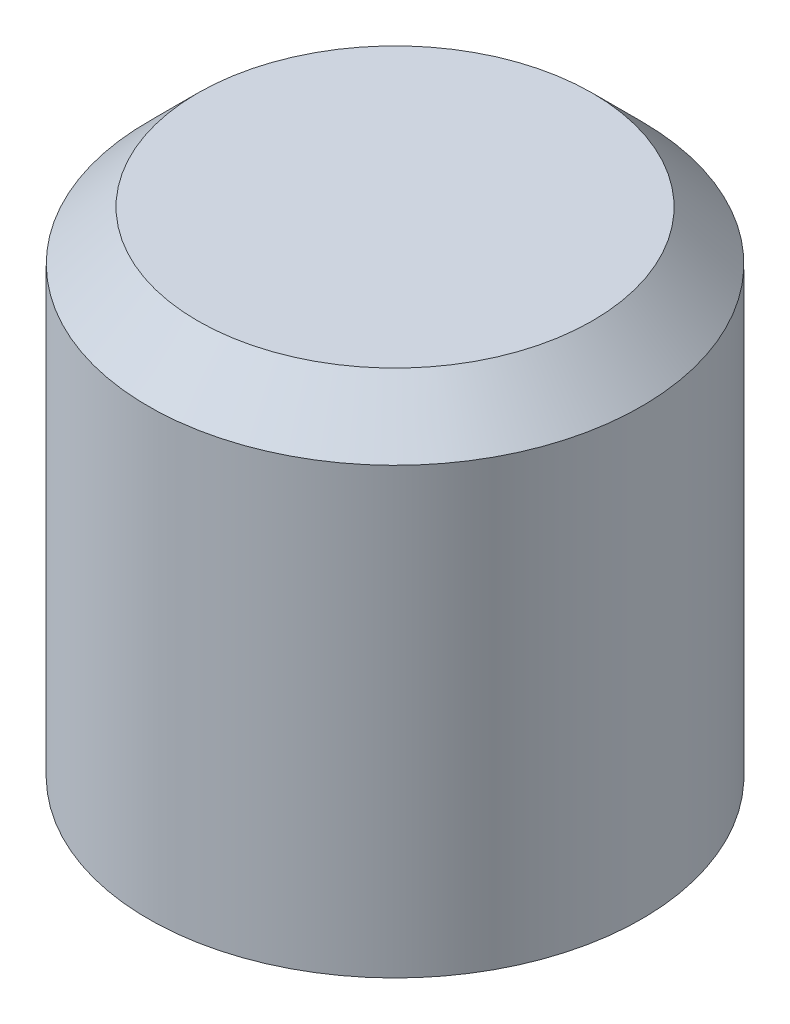
ISO-10303-21;
HEADER;
FILE_DESCRIPTION(('STEP AP214'),'2;1');
FILE_NAME('part.step','',(''),(''),'','','');
FILE_SCHEMA(('AUTOMOTIVE_DESIGN { 1 0 10303 214 1 1 1 1 }'));
ENDSEC;
DATA;
#1=APPLICATION_CONTEXT('core data for automotive mechanical design processes');
#2=APPLICATION_PROTOCOL_DEFINITION('international standard','automotive_design',2000,#1);
#3=PRODUCT_CONTEXT('',#1,'mechanical');
#4=PRODUCT('Part','Part','',(#3));
#5=PRODUCT_RELATED_PRODUCT_CATEGORY('part','',(#4));
#6=PRODUCT_DEFINITION_FORMATION('','',#4);
#7=PRODUCT_DEFINITION_CONTEXT('part definition',#1,'design');
#8=PRODUCT_DEFINITION('design','',#6,#7);
#9=PRODUCT_DEFINITION_SHAPE('','',#8);
#10=(LENGTH_UNIT() NAMED_UNIT(*) SI_UNIT(.MILLI.,.METRE.));
#11=(NAMED_UNIT(*) PLANE_ANGLE_UNIT() SI_UNIT($,.RADIAN.));
#12=(NAMED_UNIT(*) SI_UNIT($,.STERADIAN.) SOLID_ANGLE_UNIT());
#13=UNCERTAINTY_MEASURE_WITH_UNIT(LENGTH_MEASURE(1.E-05),#10,'distance_accuracy_value','');
#14=(GEOMETRIC_REPRESENTATION_CONTEXT(3) GLOBAL_UNCERTAINTY_ASSIGNED_CONTEXT((#13)) GLOBAL_UNIT_ASSIGNED_CONTEXT((#10,
#11,#12)) REPRESENTATION_CONTEXT('',''));
#15=CARTESIAN_POINT('',(0.,0.,0.));
#16=DIRECTION('',(0.,0.,1.));
#17=DIRECTION('',(1.,0.,0.));
#18=AXIS2_PLACEMENT_3D('',#15,#16,#17);
#19=CARTESIAN_POINT('',(0.,0.,0.));
#20=DIRECTION('',(0.,-1.,0.));
#21=DIRECTION('',(0.,0.,-1.));
#22=AXIS2_PLACEMENT_3D('',#19,#20,#21);
#23=PLANE('',#22);
#24=CARTESIAN_POINT('',(0.,0.,0.));
#25=DIRECTION('',(0.,-1.,0.));
#26=DIRECTION('',(0.,0.,-1.));
#27=AXIS2_PLACEMENT_3D('',#24,#25,#26);
#28=CIRCLE('',#27,10.);
#29=CARTESIAN_POINT('',(0.,0.,-10.));
#30=VERTEX_POINT('',#29);
#31=EDGE_CURVE('E10',#30,#30,#28,.T.);
#32=ORIENTED_EDGE('',*,*,#31,.T.);
#33=EDGE_LOOP('',(#32));
#34=FACE_BOUND('',#33,.T.);
#35=ADVANCED_FACE('F41',(#34),#23,.T.);
#36=CARTESIAN_POINT('',(0.,-10.,0.));
#37=DIRECTION('',(0.,-1.,0.));
#38=DIRECTION('',(0.,0.,-1.));
#39=AXIS2_PLACEMENT_3D('',#36,#37,#38);
#40=CYLINDRICAL_SURFACE('',#39,10.);
#41=CARTESIAN_POINT('',(0.,18.,0.));
#42=DIRECTION('',(0.,-1.,0.));
#43=DIRECTION('',(0.,0.,-1.));
#44=AXIS2_PLACEMENT_3D('',#41,#42,#43);
#45=CIRCLE('',#44,10.);
#46=CARTESIAN_POINT('',(0.,18.,-10.));
#47=VERTEX_POINT('',#46);
#48=EDGE_CURVE('E47',#47,#47,#45,.T.);
#49=ORIENTED_EDGE('',*,*,#48,.T.);
#50=EDGE_LOOP('',(#49));
#51=FACE_BOUND('',#50,.T.);
#52=ORIENTED_EDGE('',*,*,#31,.F.);
#53=EDGE_LOOP('',(#52));
#54=FACE_BOUND('',#53,.T.);
#55=ADVANCED_FACE('F67',(#51,#54),#40,.T.);
#56=CARTESIAN_POINT('',(0.,18.,0.));
#57=DIRECTION('',(0.,-1.,0.));
#58=DIRECTION('',(0.,0.,-1.));
#59=AXIS2_PLACEMENT_3D('',#56,#57,#58);
#60=CONICAL_SURFACE('',#59,10.,0.785398163397448);
#61=CARTESIAN_POINT('',(0.,20.,0.));
#62=DIRECTION('',(0.,-1.,0.));
#63=DIRECTION('',(0.,0.,-1.));
#64=AXIS2_PLACEMENT_3D('',#61,#62,#63);
#65=CIRCLE('',#64,8.);
#66=CARTESIAN_POINT('',(0.,20.,-8.));
#67=VERTEX_POINT('',#66);
#68=EDGE_CURVE('E51',#67,#67,#65,.T.);
#69=ORIENTED_EDGE('',*,*,#68,.T.);
#70=EDGE_LOOP('',(#69));
#71=FACE_BOUND('',#70,.T.);
#72=ORIENTED_EDGE('',*,*,#48,.F.);
#73=EDGE_LOOP('',(#72));
#74=FACE_BOUND('',#73,.T.);
#75=ADVANCED_FACE('F58',(#71,#74),#60,.T.);
#76=CARTESIAN_POINT('',(8.,20.,0.));
#77=DIRECTION('',(0.,1.,0.));
#78=DIRECTION('',(0.,0.,1.));
#79=AXIS2_PLACEMENT_3D('',#76,#77,#78);
#80=PLANE('',#79);
#81=ORIENTED_EDGE('',*,*,#68,.F.);
#82=EDGE_LOOP('',(#81));
#83=FACE_BOUND('',#82,.T.);
#84=ADVANCED_FACE('F61',(#83),#80,.T.);
#85=CLOSED_SHELL('',(#35,#55,#75,#84));
#86=MANIFOLD_SOLID_BREP('B2',#85);
#87=ADVANCED_BREP_SHAPE_REPRESENTATION('',(#18,#86),#14);
#88=SHAPE_DEFINITION_REPRESENTATION(#9,#87);
ENDSEC;
END-ISO-10303-21;
